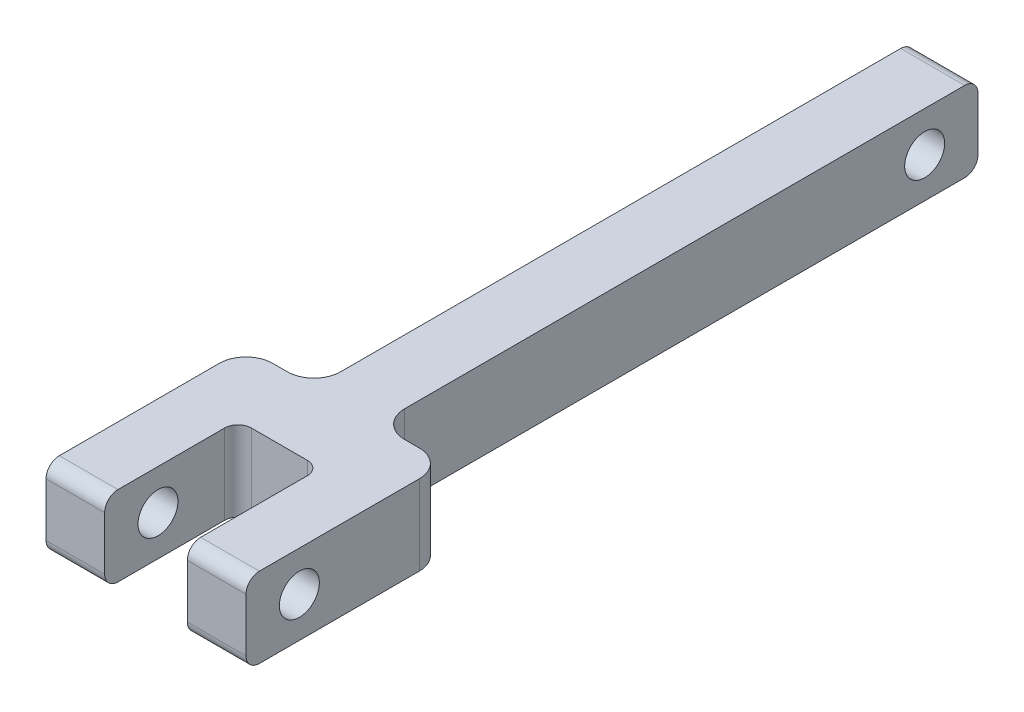
ISO-10303-21;
HEADER;
FILE_DESCRIPTION(('STEP AP214'),'2;1');
FILE_NAME('part.step','',(''),(''),'','','');
FILE_SCHEMA(('AUTOMOTIVE_DESIGN { 1 0 10303 214 1 1 1 1 }'));
ENDSEC;
DATA;
#1=APPLICATION_CONTEXT('core data for automotive mechanical design processes');
#2=APPLICATION_PROTOCOL_DEFINITION('international standard','automotive_design',2000,#1);
#3=PRODUCT_CONTEXT('',#1,'mechanical');
#4=PRODUCT('Part','Part','',(#3));
#5=PRODUCT_RELATED_PRODUCT_CATEGORY('part','',(#4));
#6=PRODUCT_DEFINITION_FORMATION('','',#4);
#7=PRODUCT_DEFINITION_CONTEXT('part definition',#1,'design');
#8=PRODUCT_DEFINITION('design','',#6,#7);
#9=PRODUCT_DEFINITION_SHAPE('','',#8);
#10=(LENGTH_UNIT() NAMED_UNIT(*) SI_UNIT(.MILLI.,.METRE.));
#11=(NAMED_UNIT(*) PLANE_ANGLE_UNIT() SI_UNIT($,.RADIAN.));
#12=(NAMED_UNIT(*) SI_UNIT($,.STERADIAN.) SOLID_ANGLE_UNIT());
#13=UNCERTAINTY_MEASURE_WITH_UNIT(LENGTH_MEASURE(1.E-05),#10,'distance_accuracy_value','');
#14=(GEOMETRIC_REPRESENTATION_CONTEXT(3) GLOBAL_UNCERTAINTY_ASSIGNED_CONTEXT((#13)) GLOBAL_UNIT_ASSIGNED_CONTEXT((#10,
#11,#12)) REPRESENTATION_CONTEXT('',''));
#15=CARTESIAN_POINT('',(0.,0.,0.));
#16=DIRECTION('',(0.,0.,1.));
#17=DIRECTION('',(1.,0.,0.));
#18=AXIS2_PLACEMENT_3D('',#15,#16,#17);
#19=CARTESIAN_POINT('',(2.4,-2.,29.));
#20=DIRECTION('',(-1.,0.,0.));
#21=DIRECTION('',(0.,0.,1.));
#22=AXIS2_PLACEMENT_3D('',#19,#20,#21);
#23=CYLINDRICAL_SURFACE('',#22,1.);
#24=CARTESIAN_POINT('',(-3.1,-2.,29.));
#25=DIRECTION('',(1.,0.,0.));
#26=DIRECTION('',(0.,0.,-1.));
#27=AXIS2_PLACEMENT_3D('',#24,#25,#26);
#28=CIRCLE('',#27,1.);
#29=CARTESIAN_POINT('',(-3.1,-2.,30.));
#30=VERTEX_POINT('',#29);
#31=CARTESIAN_POINT('',(-3.1,-3.,29.));
#32=VERTEX_POINT('',#31);
#33=EDGE_CURVE('E213',#30,#32,#28,.T.);
#34=ORIENTED_EDGE('',*,*,#33,.F.);
#35=DIRECTION('',(-1.,0.,0.));
#36=VECTOR('',#35,1.);
#37=CARTESIAN_POINT('',(2.4,-2.,30.));
#38=LINE('',#37,#36);
#39=CARTESIAN_POINT('',(-7.5,-2.,30.));
#40=VERTEX_POINT('',#39);
#41=EDGE_CURVE('E212',#30,#40,#38,.T.);
#42=ORIENTED_EDGE('',*,*,#41,.T.);
#43=CARTESIAN_POINT('',(-7.5,-2.,29.));
#44=DIRECTION('',(1.,0.,0.));
#45=DIRECTION('',(0.,0.,-1.));
#46=AXIS2_PLACEMENT_3D('',#43,#44,#45);
#47=CIRCLE('',#46,1.);
#48=CARTESIAN_POINT('',(-7.5,-3.,29.));
#49=VERTEX_POINT('',#48);
#50=EDGE_CURVE('E358',#40,#49,#47,.T.);
#51=ORIENTED_EDGE('',*,*,#50,.T.);
#52=DIRECTION('',(-1.,0.,0.));
#53=VECTOR('',#52,1.);
#54=CARTESIAN_POINT('',(2.4,-3.,29.));
#55=LINE('',#54,#53);
#56=EDGE_CURVE('E243',#32,#49,#55,.T.);
#57=ORIENTED_EDGE('',*,*,#56,.F.);
#58=EDGE_LOOP('',(#34,#42,#51,#57));
#59=FACE_BOUND('',#58,.T.);
#60=ADVANCED_FACE('F32',(#59),#23,.T.);
#61=CARTESIAN_POINT('',(2.4,-3.,29.));
#62=DIRECTION('',(0.,1.,0.));
#63=DIRECTION('',(0.,0.,1.));
#64=AXIS2_PLACEMENT_3D('',#61,#62,#63);
#65=PLANE('',#64);
#66=DIRECTION('',(-1.,0.,0.));
#67=VECTOR('',#66,1.);
#68=CARTESIAN_POINT('',(7.5,-3.,15.));
#69=LINE('',#68,#67);
#70=CARTESIAN_POINT('',(5.5,-3.,15.));
#71=VERTEX_POINT('',#70);
#72=CARTESIAN_POINT('',(4.4,-3.,15.));
#73=VERTEX_POINT('',#72);
#74=EDGE_CURVE('E371',#71,#73,#69,.T.);
#75=ORIENTED_EDGE('',*,*,#74,.F.);
#76=CARTESIAN_POINT('',(5.5,-3.,17.));
#77=DIRECTION('',(0.,1.,0.));
#78=DIRECTION('',(0.,0.,1.));
#79=AXIS2_PLACEMENT_3D('',#76,#77,#78);
#80=CIRCLE('',#79,2.);
#81=CARTESIAN_POINT('',(7.5,-3.,17.));
#82=VERTEX_POINT('',#81);
#83=EDGE_CURVE('E268',#71,#82,#80,.F.);
#84=ORIENTED_EDGE('',*,*,#83,.T.);
#85=DIRECTION('',(0.,0.,-1.));
#86=VECTOR('',#85,1.);
#87=CARTESIAN_POINT('',(7.5,-3.,15.));
#88=LINE('',#87,#86);
#89=CARTESIAN_POINT('',(7.5,-3.,29.));
#90=VERTEX_POINT('',#89);
#91=EDGE_CURVE('E349',#90,#82,#88,.T.);
#92=ORIENTED_EDGE('',*,*,#91,.F.);
#93=CARTESIAN_POINT('',(3.1,-3.,29.));
#94=VERTEX_POINT('',#93);
#95=EDGE_CURVE('E244',#90,#94,#55,.T.);
#96=ORIENTED_EDGE('',*,*,#95,.T.);
#97=DIRECTION('',(0.,0.,-1.));
#98=VECTOR('',#97,1.);
#99=CARTESIAN_POINT('',(3.1,-3.,20.));
#100=LINE('',#99,#98);
#101=CARTESIAN_POINT('',(3.1,-3.,21.));
#102=VERTEX_POINT('',#101);
#103=EDGE_CURVE('E329',#94,#102,#100,.T.);
#104=ORIENTED_EDGE('',*,*,#103,.T.);
#105=CARTESIAN_POINT('',(2.1,-3.,21.));
#106=DIRECTION('',(0.,1.,0.));
#107=DIRECTION('',(0.,0.,1.));
#108=AXIS2_PLACEMENT_3D('',#105,#106,#107);
#109=CIRCLE('',#108,1.);
#110=CARTESIAN_POINT('',(2.1,-3.,20.));
#111=VERTEX_POINT('',#110);
#112=EDGE_CURVE('E302',#102,#111,#109,.T.);
#113=ORIENTED_EDGE('',*,*,#112,.T.);
#114=DIRECTION('',(1.,0.,0.));
#115=VECTOR('',#114,1.);
#116=CARTESIAN_POINT('',(-3.1,-3.,20.));
#117=LINE('',#116,#115);
#118=CARTESIAN_POINT('',(-2.1,-3.,20.));
#119=VERTEX_POINT('',#118);
#120=EDGE_CURVE('E312',#119,#111,#117,.T.);
#121=ORIENTED_EDGE('',*,*,#120,.F.);
#122=CARTESIAN_POINT('',(-2.1,-3.,21.));
#123=DIRECTION('',(0.,1.,0.));
#124=DIRECTION('',(0.,0.,1.));
#125=AXIS2_PLACEMENT_3D('',#122,#123,#124);
#126=CIRCLE('',#125,1.);
#127=CARTESIAN_POINT('',(-3.1,-3.,21.));
#128=VERTEX_POINT('',#127);
#129=EDGE_CURVE('E11',#119,#128,#126,.T.);
#130=ORIENTED_EDGE('',*,*,#129,.T.);
#131=DIRECTION('',(0.,0.,-1.));
#132=VECTOR('',#131,1.);
#133=CARTESIAN_POINT('',(-3.1,-3.,20.));
#134=LINE('',#133,#132);
#135=EDGE_CURVE('E314',#32,#128,#134,.T.);
#136=ORIENTED_EDGE('',*,*,#135,.F.);
#137=ORIENTED_EDGE('',*,*,#56,.T.);
#138=DIRECTION('',(0.,0.,-1.));
#139=VECTOR('',#138,1.);
#140=CARTESIAN_POINT('',(-7.5,-3.,15.));
#141=LINE('',#140,#139);
#142=CARTESIAN_POINT('',(-7.5,-3.,17.));
#143=VERTEX_POINT('',#142);
#144=EDGE_CURVE('E361',#49,#143,#141,.T.);
#145=ORIENTED_EDGE('',*,*,#144,.T.);
#146=CARTESIAN_POINT('',(-5.5,-3.,17.));
#147=DIRECTION('',(0.,1.,0.));
#148=DIRECTION('',(0.,0.,1.));
#149=AXIS2_PLACEMENT_3D('',#146,#147,#148);
#150=CIRCLE('',#149,2.);
#151=CARTESIAN_POINT('',(-5.5,-3.,15.));
#152=VERTEX_POINT('',#151);
#153=EDGE_CURVE('E266',#143,#152,#150,.F.);
#154=ORIENTED_EDGE('',*,*,#153,.T.);
#155=CARTESIAN_POINT('',(-4.4,-3.,15.));
#156=VERTEX_POINT('',#155);
#157=EDGE_CURVE('E368',#156,#152,#69,.T.);
#158=ORIENTED_EDGE('',*,*,#157,.F.);
#159=CARTESIAN_POINT('',(-4.4,-3.,13.));
#160=DIRECTION('',(0.,1.,0.));
#161=DIRECTION('',(0.,0.,1.));
#162=AXIS2_PLACEMENT_3D('',#159,#160,#161);
#163=CIRCLE('',#162,2.);
#164=CARTESIAN_POINT('',(-2.4,-3.,13.));
#165=VERTEX_POINT('',#164);
#166=EDGE_CURVE('E287',#156,#165,#163,.T.);
#167=ORIENTED_EDGE('',*,*,#166,.T.);
#168=DIRECTION('',(0.,0.,-1.));
#169=VECTOR('',#168,1.);
#170=CARTESIAN_POINT('',(-2.4,-3.,29.));
#171=LINE('',#170,#169);
#172=CARTESIAN_POINT('',(-2.4,-3.,-29.));
#173=VERTEX_POINT('',#172);
#174=EDGE_CURVE('E378',#165,#173,#171,.T.);
#175=ORIENTED_EDGE('',*,*,#174,.T.);
#176=DIRECTION('',(-1.,0.,0.));
#177=VECTOR('',#176,1.);
#178=CARTESIAN_POINT('',(2.4,-3.,-29.));
#179=LINE('',#178,#177);
#180=CARTESIAN_POINT('',(2.4,-3.,-29.));
#181=VERTEX_POINT('',#180);
#182=EDGE_CURVE('E240',#181,#173,#179,.T.);
#183=ORIENTED_EDGE('',*,*,#182,.F.);
#184=DIRECTION('',(0.,0.,-1.));
#185=VECTOR('',#184,1.);
#186=CARTESIAN_POINT('',(2.4,-3.,29.));
#187=LINE('',#186,#185);
#188=CARTESIAN_POINT('',(2.4,-3.,13.));
#189=VERTEX_POINT('',#188);
#190=EDGE_CURVE('E379',#189,#181,#187,.T.);
#191=ORIENTED_EDGE('',*,*,#190,.F.);
#192=CARTESIAN_POINT('',(4.4,-3.,13.));
#193=DIRECTION('',(0.,1.,0.));
#194=DIRECTION('',(0.,0.,1.));
#195=AXIS2_PLACEMENT_3D('',#192,#193,#194);
#196=CIRCLE('',#195,2.);
#197=EDGE_CURVE('E283',#189,#73,#196,.T.);
#198=ORIENTED_EDGE('',*,*,#197,.T.);
#199=EDGE_LOOP('',(#75,#84,#92,#96,#104,#113,#121,#130,#136,#137,#145,#154,#158,#167,#175,#183,
#191,#198));
#200=FACE_BOUND('',#199,.T.);
#201=ADVANCED_FACE('F414',(#200),#65,.F.);
#202=CARTESIAN_POINT('',(2.4,3.,29.));
#203=DIRECTION('',(0.,-1.,0.));
#204=DIRECTION('',(0.,0.,-1.));
#205=AXIS2_PLACEMENT_3D('',#202,#203,#204);
#206=PLANE('',#205);
#207=DIRECTION('',(0.,0.,1.));
#208=VECTOR('',#207,1.);
#209=CARTESIAN_POINT('',(7.5,3.,29.));
#210=LINE('',#209,#208);
#211=CARTESIAN_POINT('',(7.5,3.,17.));
#212=VERTEX_POINT('',#211);
#213=CARTESIAN_POINT('',(7.5,3.,29.));
#214=VERTEX_POINT('',#213);
#215=EDGE_CURVE('E352',#212,#214,#210,.T.);
#216=ORIENTED_EDGE('',*,*,#215,.F.);
#217=CARTESIAN_POINT('',(5.5,3.,17.));
#218=DIRECTION('',(0.,-1.,0.));
#219=DIRECTION('',(0.,0.,-1.));
#220=AXIS2_PLACEMENT_3D('',#217,#218,#219);
#221=CIRCLE('',#220,2.);
#222=CARTESIAN_POINT('',(5.5,3.,15.));
#223=VERTEX_POINT('',#222);
#224=EDGE_CURVE('E260',#212,#223,#221,.F.);
#225=ORIENTED_EDGE('',*,*,#224,.T.);
#226=DIRECTION('',(-1.,0.,0.));
#227=VECTOR('',#226,1.);
#228=CARTESIAN_POINT('',(7.5,3.,15.));
#229=LINE('',#228,#227);
#230=CARTESIAN_POINT('',(4.4,3.,15.));
#231=VERTEX_POINT('',#230);
#232=EDGE_CURVE('E367',#223,#231,#229,.T.);
#233=ORIENTED_EDGE('',*,*,#232,.T.);
#234=CARTESIAN_POINT('',(4.4,3.,13.));
#235=DIRECTION('',(0.,-1.,0.));
#236=DIRECTION('',(0.,0.,-1.));
#237=AXIS2_PLACEMENT_3D('',#234,#235,#236);
#238=CIRCLE('',#237,2.);
#239=CARTESIAN_POINT('',(2.4,3.,13.));
#240=VERTEX_POINT('',#239);
#241=EDGE_CURVE('E285',#231,#240,#238,.T.);
#242=ORIENTED_EDGE('',*,*,#241,.T.);
#243=DIRECTION('',(0.,0.,1.));
#244=VECTOR('',#243,1.);
#245=CARTESIAN_POINT('',(2.4,3.,29.));
#246=LINE('',#245,#244);
#247=CARTESIAN_POINT('',(2.4,3.,-29.));
#248=VERTEX_POINT('',#247);
#249=EDGE_CURVE('E388',#248,#240,#246,.T.);
#250=ORIENTED_EDGE('',*,*,#249,.F.);
#251=DIRECTION('',(-1.,0.,0.));
#252=VECTOR('',#251,1.);
#253=CARTESIAN_POINT('',(2.4,3.,-29.));
#254=LINE('',#253,#252);
#255=CARTESIAN_POINT('',(-2.4,3.,-29.));
#256=VERTEX_POINT('',#255);
#257=EDGE_CURVE('E231',#248,#256,#254,.T.);
#258=ORIENTED_EDGE('',*,*,#257,.T.);
#259=DIRECTION('',(0.,0.,1.));
#260=VECTOR('',#259,1.);
#261=CARTESIAN_POINT('',(-2.4,3.,29.));
#262=LINE('',#261,#260);
#263=CARTESIAN_POINT('',(-2.4,3.,13.));
#264=VERTEX_POINT('',#263);
#265=EDGE_CURVE('E382',#256,#264,#262,.T.);
#266=ORIENTED_EDGE('',*,*,#265,.T.);
#267=CARTESIAN_POINT('',(-4.4,3.,13.));
#268=DIRECTION('',(0.,-1.,0.));
#269=DIRECTION('',(0.,0.,-1.));
#270=AXIS2_PLACEMENT_3D('',#267,#268,#269);
#271=CIRCLE('',#270,2.);
#272=CARTESIAN_POINT('',(-4.4,3.,15.));
#273=VERTEX_POINT('',#272);
#274=EDGE_CURVE('E289',#264,#273,#271,.T.);
#275=ORIENTED_EDGE('',*,*,#274,.T.);
#276=CARTESIAN_POINT('',(-5.5,3.,15.));
#277=VERTEX_POINT('',#276);
#278=EDGE_CURVE('E354',#273,#277,#229,.T.);
#279=ORIENTED_EDGE('',*,*,#278,.T.);
#280=CARTESIAN_POINT('',(-5.5,3.,17.));
#281=DIRECTION('',(0.,-1.,0.));
#282=DIRECTION('',(0.,0.,-1.));
#283=AXIS2_PLACEMENT_3D('',#280,#281,#282);
#284=CIRCLE('',#283,2.);
#285=CARTESIAN_POINT('',(-7.5,3.,17.));
#286=VERTEX_POINT('',#285);
#287=EDGE_CURVE('E258',#277,#286,#284,.F.);
#288=ORIENTED_EDGE('',*,*,#287,.T.);
#289=DIRECTION('',(0.,0.,1.));
#290=VECTOR('',#289,1.);
#291=CARTESIAN_POINT('',(-7.5,3.,29.));
#292=LINE('',#291,#290);
#293=CARTESIAN_POINT('',(-7.5,3.,29.));
#294=VERTEX_POINT('',#293);
#295=EDGE_CURVE('E343',#286,#294,#292,.T.);
#296=ORIENTED_EDGE('',*,*,#295,.T.);
#297=DIRECTION('',(-1.,0.,0.));
#298=VECTOR('',#297,1.);
#299=CARTESIAN_POINT('',(2.4,3.,29.));
#300=LINE('',#299,#298);
#301=CARTESIAN_POINT('',(-3.1,3.,29.));
#302=VERTEX_POINT('',#301);
#303=EDGE_CURVE('E223',#302,#294,#300,.T.);
#304=ORIENTED_EDGE('',*,*,#303,.F.);
#305=DIRECTION('',(0.,0.,1.));
#306=VECTOR('',#305,1.);
#307=CARTESIAN_POINT('',(-3.1,3.,29.));
#308=LINE('',#307,#306);
#309=CARTESIAN_POINT('',(-3.1,3.,21.));
#310=VERTEX_POINT('',#309);
#311=EDGE_CURVE('E199',#310,#302,#308,.T.);
#312=ORIENTED_EDGE('',*,*,#311,.F.);
#313=CARTESIAN_POINT('',(-2.1,3.,21.));
#314=DIRECTION('',(0.,-1.,0.));
#315=DIRECTION('',(0.,0.,-1.));
#316=AXIS2_PLACEMENT_3D('',#313,#314,#315);
#317=CIRCLE('',#316,1.);
#318=CARTESIAN_POINT('',(-2.1,3.,20.));
#319=VERTEX_POINT('',#318);
#320=EDGE_CURVE('E40',#310,#319,#317,.T.);
#321=ORIENTED_EDGE('',*,*,#320,.T.);
#322=DIRECTION('',(1.,0.,0.));
#323=VECTOR('',#322,1.);
#324=CARTESIAN_POINT('',(-3.1,3.,20.));
#325=LINE('',#324,#323);
#326=CARTESIAN_POINT('',(2.1,3.,20.));
#327=VERTEX_POINT('',#326);
#328=EDGE_CURVE('E252',#319,#327,#325,.T.);
#329=ORIENTED_EDGE('',*,*,#328,.T.);
#330=CARTESIAN_POINT('',(2.1,3.,21.));
#331=DIRECTION('',(0.,-1.,0.));
#332=DIRECTION('',(0.,0.,-1.));
#333=AXIS2_PLACEMENT_3D('',#330,#331,#332);
#334=CIRCLE('',#333,1.);
#335=CARTESIAN_POINT('',(3.1,3.,21.));
#336=VERTEX_POINT('',#335);
#337=EDGE_CURVE('E300',#327,#336,#334,.T.);
#338=ORIENTED_EDGE('',*,*,#337,.T.);
#339=DIRECTION('',(0.,0.,1.));
#340=VECTOR('',#339,1.);
#341=CARTESIAN_POINT('',(3.1,3.,29.));
#342=LINE('',#341,#340);
#343=CARTESIAN_POINT('',(3.1,3.,29.));
#344=VERTEX_POINT('',#343);
#345=EDGE_CURVE('E204',#336,#344,#342,.T.);
#346=ORIENTED_EDGE('',*,*,#345,.T.);
#347=EDGE_CURVE('E228',#214,#344,#300,.T.);
#348=ORIENTED_EDGE('',*,*,#347,.F.);
#349=EDGE_LOOP('',(#216,#225,#233,#242,#250,#258,#266,#275,#279,#288,#296,#304,#312,#321,#329,
#338,#346,#348));
#350=FACE_BOUND('',#349,.T.);
#351=ADVANCED_FACE('F307',(#350),#206,.F.);
#352=CARTESIAN_POINT('',(2.4,2.,29.));
#353=DIRECTION('',(-1.,0.,0.));
#354=DIRECTION('',(0.,0.,1.));
#355=AXIS2_PLACEMENT_3D('',#352,#353,#354);
#356=CYLINDRICAL_SURFACE('',#355,1.);
#357=CARTESIAN_POINT('',(-3.1,2.,29.));
#358=DIRECTION('',(1.,0.,0.));
#359=DIRECTION('',(0.,0.,-1.));
#360=AXIS2_PLACEMENT_3D('',#357,#358,#359);
#361=CIRCLE('',#360,1.);
#362=CARTESIAN_POINT('',(-3.1,2.,30.));
#363=VERTEX_POINT('',#362);
#364=EDGE_CURVE('E192',#302,#363,#361,.T.);
#365=ORIENTED_EDGE('',*,*,#364,.F.);
#366=ORIENTED_EDGE('',*,*,#303,.T.);
#367=CARTESIAN_POINT('',(-7.5,2.,29.));
#368=DIRECTION('',(1.,0.,0.));
#369=DIRECTION('',(0.,0.,-1.));
#370=AXIS2_PLACEMENT_3D('',#367,#368,#369);
#371=CIRCLE('',#370,1.);
#372=CARTESIAN_POINT('',(-7.5,2.,30.));
#373=VERTEX_POINT('',#372);
#374=EDGE_CURVE('E218',#294,#373,#371,.T.);
#375=ORIENTED_EDGE('',*,*,#374,.T.);
#376=DIRECTION('',(-1.,0.,0.));
#377=VECTOR('',#376,1.);
#378=CARTESIAN_POINT('',(2.4,2.,30.));
#379=LINE('',#378,#377);
#380=EDGE_CURVE('E210',#363,#373,#379,.T.);
#381=ORIENTED_EDGE('',*,*,#380,.F.);
#382=EDGE_LOOP('',(#365,#366,#375,#381));
#383=FACE_BOUND('',#382,.T.);
#384=ADVANCED_FACE('F216',(#383),#356,.T.);
#385=CARTESIAN_POINT('',(2.4,2.,30.));
#386=DIRECTION('',(0.,0.,-1.));
#387=DIRECTION('',(-1.,0.,0.));
#388=AXIS2_PLACEMENT_3D('',#385,#386,#387);
#389=PLANE('',#388);
#390=DIRECTION('',(0.,-1.,0.));
#391=VECTOR('',#390,1.);
#392=CARTESIAN_POINT('',(-3.1,2.,30.));
#393=LINE('',#392,#391);
#394=EDGE_CURVE('E196',#363,#30,#393,.T.);
#395=ORIENTED_EDGE('',*,*,#394,.F.);
#396=ORIENTED_EDGE('',*,*,#380,.T.);
#397=DIRECTION('',(0.,-1.,0.));
#398=VECTOR('',#397,1.);
#399=CARTESIAN_POINT('',(-7.5,2.,30.));
#400=LINE('',#399,#398);
#401=EDGE_CURVE('E356',#373,#40,#400,.T.);
#402=ORIENTED_EDGE('',*,*,#401,.T.);
#403=ORIENTED_EDGE('',*,*,#41,.F.);
#404=EDGE_LOOP('',(#395,#396,#402,#403));
#405=FACE_BOUND('',#404,.T.);
#406=ADVANCED_FACE('F208',(#405),#389,.F.);
#407=CARTESIAN_POINT('',(-2.4,0.,26.));
#408=DIRECTION('',(1.,0.,0.));
#409=DIRECTION('',(0.,0.,-1.));
#410=AXIS2_PLACEMENT_3D('',#407,#408,#409);
#411=CYLINDRICAL_SURFACE('',#410,1.5);
#412=CARTESIAN_POINT('',(-7.5,0.,26.));
#413=DIRECTION('',(1.,0.,0.));
#414=DIRECTION('',(0.,0.,-1.));
#415=AXIS2_PLACEMENT_3D('',#412,#413,#414);
#416=CIRCLE('',#415,1.5);
#417=CARTESIAN_POINT('',(-7.5,0.,24.5));
#418=VERTEX_POINT('',#417);
#419=EDGE_CURVE('E255',#418,#418,#416,.T.);
#420=ORIENTED_EDGE('',*,*,#419,.F.);
#421=EDGE_LOOP('',(#420));
#422=FACE_BOUND('',#421,.T.);
#423=CARTESIAN_POINT('',(-3.1,0.,26.));
#424=DIRECTION('',(1.,0.,0.));
#425=DIRECTION('',(0.,0.,-1.));
#426=AXIS2_PLACEMENT_3D('',#423,#424,#425);
#427=CIRCLE('',#426,1.5);
#428=CARTESIAN_POINT('',(-3.1,0.,24.5));
#429=VERTEX_POINT('',#428);
#430=EDGE_CURVE('E251',#429,#429,#427,.F.);
#431=ORIENTED_EDGE('',*,*,#430,.F.);
#432=EDGE_LOOP('',(#431));
#433=FACE_BOUND('',#432,.T.);
#434=ADVANCED_FACE('F514',(#422,#433),#411,.F.);
#435=CARTESIAN_POINT('',(2.4,-2.,29.));
#436=DIRECTION('',(1.,0.,0.));
#437=DIRECTION('',(0.,0.,-1.));
#438=AXIS2_PLACEMENT_3D('',#435,#436,#437);
#439=PLANE('',#438);
#440=CARTESIAN_POINT('',(2.4,0.,-26.));
#441=DIRECTION('',(1.,0.,0.));
#442=DIRECTION('',(0.,0.,-1.));
#443=AXIS2_PLACEMENT_3D('',#440,#441,#442);
#444=CIRCLE('',#443,1.50000000000001);
#445=CARTESIAN_POINT('',(2.4,0.,-27.5));
#446=VERTEX_POINT('',#445);
#447=EDGE_CURVE('E372',#446,#446,#444,.T.);
#448=ORIENTED_EDGE('',*,*,#447,.F.);
#449=EDGE_LOOP('',(#448));
#450=FACE_BOUND('',#449,.T.);
#451=ORIENTED_EDGE('',*,*,#249,.T.);
#452=DIRECTION('',(0.,-1.,0.));
#453=VECTOR('',#452,1.);
#454=CARTESIAN_POINT('',(2.4,-2.,13.));
#455=LINE('',#454,#453);
#456=EDGE_CURVE('E278',#240,#189,#455,.T.);
#457=ORIENTED_EDGE('',*,*,#456,.T.);
#458=ORIENTED_EDGE('',*,*,#190,.T.);
#459=CARTESIAN_POINT('',(2.4,-2.,-29.));
#460=DIRECTION('',(1.,0.,0.));
#461=DIRECTION('',(0.,0.,-1.));
#462=AXIS2_PLACEMENT_3D('',#459,#460,#461);
#463=CIRCLE('',#462,1.);
#464=CARTESIAN_POINT('',(2.4,-2.,-30.));
#465=VERTEX_POINT('',#464);
#466=EDGE_CURVE('E381',#181,#465,#463,.T.);
#467=ORIENTED_EDGE('',*,*,#466,.T.);
#468=DIRECTION('',(0.,1.,0.));
#469=VECTOR('',#468,1.);
#470=CARTESIAN_POINT('',(2.4,2.,-30.));
#471=LINE('',#470,#469);
#472=CARTESIAN_POINT('',(2.4,2.,-30.));
#473=VERTEX_POINT('',#472);
#474=EDGE_CURVE('E384',#465,#473,#471,.T.);
#475=ORIENTED_EDGE('',*,*,#474,.T.);
#476=CARTESIAN_POINT('',(2.4,2.,-29.));
#477=DIRECTION('',(1.,0.,0.));
#478=DIRECTION('',(0.,0.,1.));
#479=AXIS2_PLACEMENT_3D('',#476,#477,#478);
#480=CIRCLE('',#479,1.);
#481=EDGE_CURVE('E386',#473,#248,#480,.T.);
#482=ORIENTED_EDGE('',*,*,#481,.T.);
#483=EDGE_LOOP('',(#451,#457,#458,#467,#475,#482));
#484=FACE_BOUND('',#483,.T.);
#485=ADVANCED_FACE('F446',(#450,#484),#439,.T.);
#486=CARTESIAN_POINT('',(-2.4,-2.,29.));
#487=DIRECTION('',(1.,0.,0.));
#488=DIRECTION('',(0.,0.,-1.));
#489=AXIS2_PLACEMENT_3D('',#486,#487,#488);
#490=PLANE('',#489);
#491=CARTESIAN_POINT('',(-2.4,0.,-26.));
#492=DIRECTION('',(1.,0.,0.));
#493=DIRECTION('',(0.,0.,-1.));
#494=AXIS2_PLACEMENT_3D('',#491,#492,#493);
#495=CIRCLE('',#494,1.50000000000001);
#496=CARTESIAN_POINT('',(-2.4,0.,-27.5));
#497=VERTEX_POINT('',#496);
#498=EDGE_CURVE('E375',#497,#497,#495,.T.);
#499=ORIENTED_EDGE('',*,*,#498,.T.);
#500=EDGE_LOOP('',(#499));
#501=FACE_BOUND('',#500,.T.);
#502=ORIENTED_EDGE('',*,*,#174,.F.);
#503=DIRECTION('',(0.,-1.,0.));
#504=VECTOR('',#503,1.);
#505=CARTESIAN_POINT('',(-2.4,3.,13.));
#506=LINE('',#505,#504);
#507=EDGE_CURVE('E281',#165,#264,#506,.F.);
#508=ORIENTED_EDGE('',*,*,#507,.T.);
#509=ORIENTED_EDGE('',*,*,#265,.F.);
#510=CARTESIAN_POINT('',(-2.4,2.,-29.));
#511=DIRECTION('',(1.,0.,0.));
#512=DIRECTION('',(0.,0.,1.));
#513=AXIS2_PLACEMENT_3D('',#510,#511,#512);
#514=CIRCLE('',#513,1.);
#515=CARTESIAN_POINT('',(-2.4,2.,-30.));
#516=VERTEX_POINT('',#515);
#517=EDGE_CURVE('E396',#516,#256,#514,.T.);
#518=ORIENTED_EDGE('',*,*,#517,.F.);
#519=DIRECTION('',(0.,1.,0.));
#520=VECTOR('',#519,1.);
#521=CARTESIAN_POINT('',(-2.4,2.,-30.));
#522=LINE('',#521,#520);
#523=CARTESIAN_POINT('',(-2.4,-2.,-30.));
#524=VERTEX_POINT('',#523);
#525=EDGE_CURVE('E394',#524,#516,#522,.T.);
#526=ORIENTED_EDGE('',*,*,#525,.F.);
#527=CARTESIAN_POINT('',(-2.4,-2.,-29.));
#528=DIRECTION('',(1.,0.,0.));
#529=DIRECTION('',(0.,0.,-1.));
#530=AXIS2_PLACEMENT_3D('',#527,#528,#529);
#531=CIRCLE('',#530,1.);
#532=EDGE_CURVE('E392',#173,#524,#531,.T.);
#533=ORIENTED_EDGE('',*,*,#532,.F.);
#534=EDGE_LOOP('',(#502,#508,#509,#518,#526,#533));
#535=FACE_BOUND('',#534,.T.);
#536=ADVANCED_FACE('F437',(#501,#535),#490,.F.);
#537=CARTESIAN_POINT('',(7.5,-2.,30.));
#538=VERTEX_POINT('',#537);
#539=CARTESIAN_POINT('',(3.1,-2.,30.));
#540=VERTEX_POINT('',#539);
#541=EDGE_CURVE('E220',#538,#540,#38,.T.);
#542=ORIENTED_EDGE('',*,*,#541,.T.);
#543=CARTESIAN_POINT('',(3.1,-2.,29.));
#544=DIRECTION('',(1.,0.,0.));
#545=DIRECTION('',(0.,0.,-1.));
#546=AXIS2_PLACEMENT_3D('',#543,#544,#545);
#547=CIRCLE('',#546,1.);
#548=EDGE_CURVE('E326',#540,#94,#547,.T.);
#549=ORIENTED_EDGE('',*,*,#548,.T.);
#550=ORIENTED_EDGE('',*,*,#95,.F.);
#551=CARTESIAN_POINT('',(7.5,-2.,29.));
#552=DIRECTION('',(1.,0.,0.));
#553=DIRECTION('',(0.,0.,-1.));
#554=AXIS2_PLACEMENT_3D('',#551,#552,#553);
#555=CIRCLE('',#554,1.);
#556=EDGE_CURVE('E346',#538,#90,#555,.T.);
#557=ORIENTED_EDGE('',*,*,#556,.F.);
#558=EDGE_LOOP('',(#542,#549,#550,#557));
#559=FACE_BOUND('',#558,.T.);
#560=ADVANCED_FACE('F429',(#559),#23,.T.);
#561=CARTESIAN_POINT('',(2.4,-2.,-29.));
#562=DIRECTION('',(-1.,0.,0.));
#563=DIRECTION('',(0.,0.,1.));
#564=AXIS2_PLACEMENT_3D('',#561,#562,#563);
#565=CYLINDRICAL_SURFACE('',#564,1.);
#566=ORIENTED_EDGE('',*,*,#532,.T.);
#567=DIRECTION('',(-1.,0.,0.));
#568=VECTOR('',#567,1.);
#569=CARTESIAN_POINT('',(2.4,-2.,-30.));
#570=LINE('',#569,#568);
#571=EDGE_CURVE('E237',#465,#524,#570,.T.);
#572=ORIENTED_EDGE('',*,*,#571,.F.);
#573=ORIENTED_EDGE('',*,*,#466,.F.);
#574=ORIENTED_EDGE('',*,*,#182,.T.);
#575=EDGE_LOOP('',(#566,#572,#573,#574));
#576=FACE_BOUND('',#575,.T.);
#577=ADVANCED_FACE('F436',(#576),#565,.T.);
#578=CARTESIAN_POINT('',(2.4,2.,-30.));
#579=DIRECTION('',(0.,0.,1.));
#580=DIRECTION('',(1.,0.,0.));
#581=AXIS2_PLACEMENT_3D('',#578,#579,#580);
#582=PLANE('',#581);
#583=ORIENTED_EDGE('',*,*,#525,.T.);
#584=DIRECTION('',(-1.,0.,0.));
#585=VECTOR('',#584,1.);
#586=CARTESIAN_POINT('',(2.4,2.,-30.));
#587=LINE('',#586,#585);
#588=EDGE_CURVE('E234',#473,#516,#587,.T.);
#589=ORIENTED_EDGE('',*,*,#588,.F.);
#590=ORIENTED_EDGE('',*,*,#474,.F.);
#591=ORIENTED_EDGE('',*,*,#571,.T.);
#592=EDGE_LOOP('',(#583,#589,#590,#591));
#593=FACE_BOUND('',#592,.T.);
#594=ADVANCED_FACE('F443',(#593),#582,.F.);
#595=CARTESIAN_POINT('',(2.4,2.,-29.));
#596=DIRECTION('',(-1.,0.,0.));
#597=DIRECTION('',(0.,0.,1.));
#598=AXIS2_PLACEMENT_3D('',#595,#596,#597);
#599=CYLINDRICAL_SURFACE('',#598,1.);
#600=ORIENTED_EDGE('',*,*,#517,.T.);
#601=ORIENTED_EDGE('',*,*,#257,.F.);
#602=ORIENTED_EDGE('',*,*,#481,.F.);
#603=ORIENTED_EDGE('',*,*,#588,.T.);
#604=EDGE_LOOP('',(#600,#601,#602,#603));
#605=FACE_BOUND('',#604,.T.);
#606=ADVANCED_FACE('F491',(#605),#599,.T.);
#607=ORIENTED_EDGE('',*,*,#347,.T.);
#608=CARTESIAN_POINT('',(3.1,2.,29.));
#609=DIRECTION('',(1.,0.,0.));
#610=DIRECTION('',(0.,0.,-1.));
#611=AXIS2_PLACEMENT_3D('',#608,#609,#610);
#612=CIRCLE('',#611,1.);
#613=CARTESIAN_POINT('',(3.1,2.,30.));
#614=VERTEX_POINT('',#613);
#615=EDGE_CURVE('E320',#344,#614,#612,.T.);
#616=ORIENTED_EDGE('',*,*,#615,.T.);
#617=CARTESIAN_POINT('',(7.5,2.,30.));
#618=VERTEX_POINT('',#617);
#619=EDGE_CURVE('E219',#618,#614,#379,.T.);
#620=ORIENTED_EDGE('',*,*,#619,.F.);
#621=CARTESIAN_POINT('',(7.5,2.,29.));
#622=DIRECTION('',(1.,0.,0.));
#623=DIRECTION('',(0.,0.,-1.));
#624=AXIS2_PLACEMENT_3D('',#621,#622,#623);
#625=CIRCLE('',#624,1.);
#626=EDGE_CURVE('E339',#214,#618,#625,.T.);
#627=ORIENTED_EDGE('',*,*,#626,.F.);
#628=EDGE_LOOP('',(#607,#616,#620,#627));
#629=FACE_BOUND('',#628,.T.);
#630=ADVANCED_FACE('F460',(#629),#356,.T.);
#631=ORIENTED_EDGE('',*,*,#619,.T.);
#632=DIRECTION('',(0.,-1.,0.));
#633=VECTOR('',#632,1.);
#634=CARTESIAN_POINT('',(3.1,2.,30.));
#635=LINE('',#634,#633);
#636=EDGE_CURVE('E323',#614,#540,#635,.T.);
#637=ORIENTED_EDGE('',*,*,#636,.T.);
#638=ORIENTED_EDGE('',*,*,#541,.F.);
#639=DIRECTION('',(0.,-1.,0.));
#640=VECTOR('',#639,1.);
#641=CARTESIAN_POINT('',(7.5,2.,30.));
#642=LINE('',#641,#640);
#643=EDGE_CURVE('E342',#618,#538,#642,.T.);
#644=ORIENTED_EDGE('',*,*,#643,.F.);
#645=EDGE_LOOP('',(#631,#637,#638,#644));
#646=FACE_BOUND('',#645,.T.);
#647=ADVANCED_FACE('F452',(#646),#389,.F.);
#648=CARTESIAN_POINT('',(-2.4,0.,-26.));
#649=DIRECTION('',(1.,0.,0.));
#650=DIRECTION('',(0.,0.,-1.));
#651=AXIS2_PLACEMENT_3D('',#648,#649,#650);
#652=CYLINDRICAL_SURFACE('',#651,1.50000000000001);
#653=ORIENTED_EDGE('',*,*,#498,.F.);
#654=EDGE_LOOP('',(#653));
#655=FACE_BOUND('',#654,.T.);
#656=ORIENTED_EDGE('',*,*,#447,.T.);
#657=EDGE_LOOP('',(#656));
#658=FACE_BOUND('',#657,.T.);
#659=ADVANCED_FACE('F510',(#655,#658),#652,.F.);
#660=CARTESIAN_POINT('',(7.5,3.,15.));
#661=DIRECTION('',(0.,0.,1.));
#662=DIRECTION('',(1.,0.,0.));
#663=AXIS2_PLACEMENT_3D('',#660,#661,#662);
#664=PLANE('',#663);
#665=ORIENTED_EDGE('',*,*,#157,.T.);
#666=DIRECTION('',(0.,1.,0.));
#667=VECTOR('',#666,1.);
#668=CARTESIAN_POINT('',(-5.5,3.,15.));
#669=LINE('',#668,#667);
#670=EDGE_CURVE('E273',#152,#277,#669,.T.);
#671=ORIENTED_EDGE('',*,*,#670,.T.);
#672=ORIENTED_EDGE('',*,*,#278,.F.);
#673=DIRECTION('',(0.,-1.,0.));
#674=VECTOR('',#673,1.);
#675=CARTESIAN_POINT('',(-4.4,-3.,15.));
#676=LINE('',#675,#674);
#677=EDGE_CURVE('E270',#273,#156,#676,.T.);
#678=ORIENTED_EDGE('',*,*,#677,.T.);
#679=EDGE_LOOP('',(#665,#671,#672,#678));
#680=FACE_BOUND('',#679,.T.);
#681=ADVANCED_FACE('F411',(#680),#664,.F.);
#682=CARTESIAN_POINT('',(-7.5,2.,29.));
#683=DIRECTION('',(1.,0.,0.));
#684=DIRECTION('',(0.,0.,-1.));
#685=AXIS2_PLACEMENT_3D('',#682,#683,#684);
#686=PLANE('',#685);
#687=ORIENTED_EDGE('',*,*,#295,.F.);
#688=DIRECTION('',(0.,1.,0.));
#689=VECTOR('',#688,1.);
#690=CARTESIAN_POINT('',(-7.5,2.,17.));
#691=LINE('',#690,#689);
#692=EDGE_CURVE('E276',#286,#143,#691,.F.);
#693=ORIENTED_EDGE('',*,*,#692,.T.);
#694=ORIENTED_EDGE('',*,*,#144,.F.);
#695=ORIENTED_EDGE('',*,*,#50,.F.);
#696=ORIENTED_EDGE('',*,*,#401,.F.);
#697=ORIENTED_EDGE('',*,*,#374,.F.);
#698=EDGE_LOOP('',(#687,#693,#694,#695,#696,#697));
#699=FACE_BOUND('',#698,.T.);
#700=ORIENTED_EDGE('',*,*,#419,.T.);
#701=EDGE_LOOP('',(#700));
#702=FACE_BOUND('',#701,.T.);
#703=ADVANCED_FACE('F423',(#699,#702),#686,.F.);
#704=CARTESIAN_POINT('',(3.1,0.,26.));
#705=DIRECTION('',(1.,0.,0.));
#706=DIRECTION('',(0.,0.,-1.));
#707=AXIS2_PLACEMENT_3D('',#704,#705,#706);
#708=CIRCLE('',#707,1.5);
#709=CARTESIAN_POINT('',(3.1,0.,24.5));
#710=VERTEX_POINT('',#709);
#711=EDGE_CURVE('E248',#710,#710,#708,.F.);
#712=ORIENTED_EDGE('',*,*,#711,.T.);
#713=EDGE_LOOP('',(#712));
#714=FACE_BOUND('',#713,.T.);
#715=CARTESIAN_POINT('',(7.5,0.,26.));
#716=DIRECTION('',(1.,0.,0.));
#717=DIRECTION('',(0.,0.,-1.));
#718=AXIS2_PLACEMENT_3D('',#715,#716,#717);
#719=CIRCLE('',#718,1.5);
#720=CARTESIAN_POINT('',(7.5,0.,24.5));
#721=VERTEX_POINT('',#720);
#722=EDGE_CURVE('E334',#721,#721,#719,.T.);
#723=ORIENTED_EDGE('',*,*,#722,.T.);
#724=EDGE_LOOP('',(#723));
#725=FACE_BOUND('',#724,.T.);
#726=ADVANCED_FACE('F519',(#714,#725),#411,.F.);
#727=CARTESIAN_POINT('',(7.5,2.,29.));
#728=DIRECTION('',(1.,0.,0.));
#729=DIRECTION('',(0.,0.,-1.));
#730=AXIS2_PLACEMENT_3D('',#727,#728,#729);
#731=PLANE('',#730);
#732=ORIENTED_EDGE('',*,*,#91,.T.);
#733=DIRECTION('',(0.,1.,0.));
#734=VECTOR('',#733,1.);
#735=CARTESIAN_POINT('',(7.5,3.,17.));
#736=LINE('',#735,#734);
#737=EDGE_CURVE('E247',#82,#212,#736,.T.);
#738=ORIENTED_EDGE('',*,*,#737,.T.);
#739=ORIENTED_EDGE('',*,*,#215,.T.);
#740=ORIENTED_EDGE('',*,*,#626,.T.);
#741=ORIENTED_EDGE('',*,*,#643,.T.);
#742=ORIENTED_EDGE('',*,*,#556,.T.);
#743=EDGE_LOOP('',(#732,#738,#739,#740,#741,#742));
#744=FACE_BOUND('',#743,.T.);
#745=ORIENTED_EDGE('',*,*,#722,.F.);
#746=EDGE_LOOP('',(#745));
#747=FACE_BOUND('',#746,.T.);
#748=ADVANCED_FACE('F454',(#744,#747),#731,.T.);
#749=ORIENTED_EDGE('',*,*,#232,.F.);
#750=DIRECTION('',(0.,1.,0.));
#751=VECTOR('',#750,1.);
#752=CARTESIAN_POINT('',(5.5,-3.,15.));
#753=LINE('',#752,#751);
#754=EDGE_CURVE('E264',#223,#71,#753,.F.);
#755=ORIENTED_EDGE('',*,*,#754,.T.);
#756=ORIENTED_EDGE('',*,*,#74,.T.);
#757=DIRECTION('',(0.,-1.,0.));
#758=VECTOR('',#757,1.);
#759=CARTESIAN_POINT('',(4.4,3.,15.));
#760=LINE('',#759,#758);
#761=EDGE_CURVE('E262',#73,#231,#760,.F.);
#762=ORIENTED_EDGE('',*,*,#761,.T.);
#763=EDGE_LOOP('',(#749,#755,#756,#762));
#764=FACE_BOUND('',#763,.T.);
#765=ADVANCED_FACE('F477',(#764),#664,.F.);
#766=CARTESIAN_POINT('',(-3.1,2.,29.));
#767=DIRECTION('',(1.,0.,0.));
#768=DIRECTION('',(0.,0.,-1.));
#769=AXIS2_PLACEMENT_3D('',#766,#767,#768);
#770=PLANE('',#769);
#771=ORIENTED_EDGE('',*,*,#135,.T.);
#772=DIRECTION('',(0.,1.,0.));
#773=VECTOR('',#772,1.);
#774=CARTESIAN_POINT('',(-3.1,2.,21.));
#775=LINE('',#774,#773);
#776=EDGE_CURVE('E298',#128,#310,#775,.T.);
#777=ORIENTED_EDGE('',*,*,#776,.T.);
#778=ORIENTED_EDGE('',*,*,#311,.T.);
#779=ORIENTED_EDGE('',*,*,#364,.T.);
#780=ORIENTED_EDGE('',*,*,#394,.T.);
#781=ORIENTED_EDGE('',*,*,#33,.T.);
#782=EDGE_LOOP('',(#771,#777,#778,#779,#780,#781));
#783=FACE_BOUND('',#782,.T.);
#784=ORIENTED_EDGE('',*,*,#430,.T.);
#785=EDGE_LOOP('',(#784));
#786=FACE_BOUND('',#785,.T.);
#787=ADVANCED_FACE('F194',(#783,#786),#770,.T.);
#788=CARTESIAN_POINT('',(3.1,2.,29.));
#789=DIRECTION('',(1.,0.,0.));
#790=DIRECTION('',(0.,0.,-1.));
#791=AXIS2_PLACEMENT_3D('',#788,#789,#790);
#792=PLANE('',#791);
#793=ORIENTED_EDGE('',*,*,#345,.F.);
#794=DIRECTION('',(0.,1.,0.));
#795=VECTOR('',#794,1.);
#796=CARTESIAN_POINT('',(3.1,-3.,21.));
#797=LINE('',#796,#795);
#798=EDGE_CURVE('E296',#336,#102,#797,.F.);
#799=ORIENTED_EDGE('',*,*,#798,.T.);
#800=ORIENTED_EDGE('',*,*,#103,.F.);
#801=ORIENTED_EDGE('',*,*,#548,.F.);
#802=ORIENTED_EDGE('',*,*,#636,.F.);
#803=ORIENTED_EDGE('',*,*,#615,.F.);
#804=EDGE_LOOP('',(#793,#799,#800,#801,#802,#803));
#805=FACE_BOUND('',#804,.T.);
#806=ORIENTED_EDGE('',*,*,#711,.F.);
#807=EDGE_LOOP('',(#806));
#808=FACE_BOUND('',#807,.T.);
#809=ADVANCED_FACE('F464',(#805,#808),#792,.F.);
#810=CARTESIAN_POINT('',(-3.1,3.,20.));
#811=DIRECTION('',(0.,0.,-1.));
#812=DIRECTION('',(-1.,0.,0.));
#813=AXIS2_PLACEMENT_3D('',#810,#811,#812);
#814=PLANE('',#813);
#815=ORIENTED_EDGE('',*,*,#120,.T.);
#816=DIRECTION('',(0.,1.,0.));
#817=VECTOR('',#816,1.);
#818=CARTESIAN_POINT('',(2.1,3.,20.));
#819=LINE('',#818,#817);
#820=EDGE_CURVE('E293',#111,#327,#819,.T.);
#821=ORIENTED_EDGE('',*,*,#820,.T.);
#822=ORIENTED_EDGE('',*,*,#328,.F.);
#823=DIRECTION('',(0.,1.,0.));
#824=VECTOR('',#823,1.);
#825=CARTESIAN_POINT('',(-2.1,3.,20.));
#826=LINE('',#825,#824);
#827=EDGE_CURVE('E291',#319,#119,#826,.F.);
#828=ORIENTED_EDGE('',*,*,#827,.T.);
#829=EDGE_LOOP('',(#815,#821,#822,#828));
#830=FACE_BOUND('',#829,.T.);
#831=ADVANCED_FACE('F310',(#830),#814,.F.);
#832=CARTESIAN_POINT('',(5.5,2.,17.));
#833=DIRECTION('',(0.,-1.,0.));
#834=DIRECTION('',(0.,0.,-1.));
#835=AXIS2_PLACEMENT_3D('',#832,#833,#834);
#836=CYLINDRICAL_SURFACE('',#835,2.);
#837=ORIENTED_EDGE('',*,*,#83,.F.);
#838=ORIENTED_EDGE('',*,*,#754,.F.);
#839=ORIENTED_EDGE('',*,*,#224,.F.);
#840=ORIENTED_EDGE('',*,*,#737,.F.);
#841=EDGE_LOOP('',(#837,#838,#839,#840));
#842=FACE_BOUND('',#841,.T.);
#843=ADVANCED_FACE('F481',(#842),#836,.T.);
#844=CARTESIAN_POINT('',(-5.5,3.,17.));
#845=DIRECTION('',(0.,1.,0.));
#846=DIRECTION('',(0.,0.,1.));
#847=AXIS2_PLACEMENT_3D('',#844,#845,#846);
#848=CYLINDRICAL_SURFACE('',#847,2.);
#849=ORIENTED_EDGE('',*,*,#153,.F.);
#850=ORIENTED_EDGE('',*,*,#692,.F.);
#851=ORIENTED_EDGE('',*,*,#287,.F.);
#852=ORIENTED_EDGE('',*,*,#670,.F.);
#853=EDGE_LOOP('',(#849,#850,#851,#852));
#854=FACE_BOUND('',#853,.T.);
#855=ADVANCED_FACE('F420',(#854),#848,.T.);
#856=CARTESIAN_POINT('',(4.4,-2.,13.));
#857=DIRECTION('',(0.,-1.,0.));
#858=DIRECTION('',(0.,0.,-1.));
#859=AXIS2_PLACEMENT_3D('',#856,#857,#858);
#860=CYLINDRICAL_SURFACE('',#859,2.);
#861=ORIENTED_EDGE('',*,*,#241,.F.);
#862=ORIENTED_EDGE('',*,*,#761,.F.);
#863=ORIENTED_EDGE('',*,*,#197,.F.);
#864=ORIENTED_EDGE('',*,*,#456,.F.);
#865=EDGE_LOOP('',(#861,#862,#863,#864));
#866=FACE_BOUND('',#865,.T.);
#867=ADVANCED_FACE('F484',(#866),#860,.F.);
#868=CARTESIAN_POINT('',(-4.4,3.,13.));
#869=DIRECTION('',(0.,1.,0.));
#870=DIRECTION('',(0.,0.,1.));
#871=AXIS2_PLACEMENT_3D('',#868,#869,#870);
#872=CYLINDRICAL_SURFACE('',#871,2.);
#873=ORIENTED_EDGE('',*,*,#274,.F.);
#874=ORIENTED_EDGE('',*,*,#507,.F.);
#875=ORIENTED_EDGE('',*,*,#166,.F.);
#876=ORIENTED_EDGE('',*,*,#677,.F.);
#877=EDGE_LOOP('',(#873,#874,#875,#876));
#878=FACE_BOUND('',#877,.T.);
#879=ADVANCED_FACE('F408',(#878),#872,.F.);
#880=CARTESIAN_POINT('',(2.1,3.,21.));
#881=DIRECTION('',(0.,-1.,0.));
#882=DIRECTION('',(0.,0.,-1.));
#883=AXIS2_PLACEMENT_3D('',#880,#881,#882);
#884=CYLINDRICAL_SURFACE('',#883,1.);
#885=ORIENTED_EDGE('',*,*,#112,.F.);
#886=ORIENTED_EDGE('',*,*,#798,.F.);
#887=ORIENTED_EDGE('',*,*,#337,.F.);
#888=ORIENTED_EDGE('',*,*,#820,.F.);
#889=EDGE_LOOP('',(#885,#886,#887,#888));
#890=FACE_BOUND('',#889,.T.);
#891=ADVANCED_FACE('F469',(#890),#884,.F.);
#892=CARTESIAN_POINT('',(-2.1,2.,21.));
#893=DIRECTION('',(0.,1.,0.));
#894=DIRECTION('',(0.,0.,1.));
#895=AXIS2_PLACEMENT_3D('',#892,#893,#894);
#896=CYLINDRICAL_SURFACE('',#895,1.);
#897=ORIENTED_EDGE('',*,*,#129,.F.);
#898=ORIENTED_EDGE('',*,*,#827,.F.);
#899=ORIENTED_EDGE('',*,*,#320,.F.);
#900=ORIENTED_EDGE('',*,*,#776,.F.);
#901=EDGE_LOOP('',(#897,#898,#899,#900));
#902=FACE_BOUND('',#901,.T.);
#903=ADVANCED_FACE('F34',(#902),#896,.F.);
#904=CLOSED_SHELL('',(#60,#201,#351,#384,#406,#434,#485,#536,#560,#577,#594,#606,#630,#647,#659,
#681,#703,#726,#748,#765,#787,#809,#831,#843,#855,#867,#879,#891,#903));
#905=MANIFOLD_SOLID_BREP('B2',#904);
#906=ADVANCED_BREP_SHAPE_REPRESENTATION('',(#18,#905),#14);
#907=SHAPE_DEFINITION_REPRESENTATION(#9,#906);
ENDSEC;
END-ISO-10303-21;
